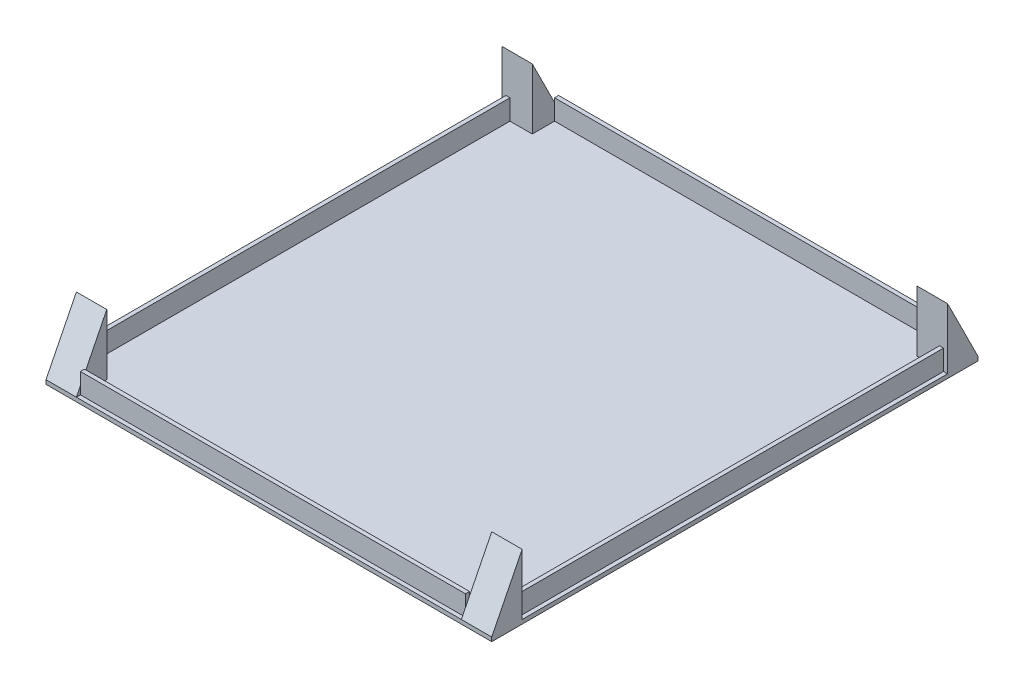
ISO-10303-21;
HEADER;
FILE_DESCRIPTION(('STEP AP214'),'2;1');
FILE_NAME('part.step','',(''),(''),'','','');
FILE_SCHEMA(('AUTOMOTIVE_DESIGN { 1 0 10303 214 1 1 1 1 }'));
ENDSEC;
DATA;
#1=APPLICATION_CONTEXT('core data for automotive mechanical design processes');
#2=APPLICATION_PROTOCOL_DEFINITION('international standard','automotive_design',2000,#1);
#3=PRODUCT_CONTEXT('',#1,'mechanical');
#4=PRODUCT('Part','Part','',(#3));
#5=PRODUCT_RELATED_PRODUCT_CATEGORY('part','',(#4));
#6=PRODUCT_DEFINITION_FORMATION('','',#4);
#7=PRODUCT_DEFINITION_CONTEXT('part definition',#1,'design');
#8=PRODUCT_DEFINITION('design','',#6,#7);
#9=PRODUCT_DEFINITION_SHAPE('','',#8);
#10=(LENGTH_UNIT() NAMED_UNIT(*) SI_UNIT(.MILLI.,.METRE.));
#11=(NAMED_UNIT(*) PLANE_ANGLE_UNIT() SI_UNIT($,.RADIAN.));
#12=(NAMED_UNIT(*) SI_UNIT($,.STERADIAN.) SOLID_ANGLE_UNIT());
#13=UNCERTAINTY_MEASURE_WITH_UNIT(LENGTH_MEASURE(1.E-05),#10,'distance_accuracy_value','');
#14=(GEOMETRIC_REPRESENTATION_CONTEXT(3) GLOBAL_UNCERTAINTY_ASSIGNED_CONTEXT((#13)) GLOBAL_UNIT_ASSIGNED_CONTEXT((#10,
#11,#12)) REPRESENTATION_CONTEXT('',''));
#15=CARTESIAN_POINT('',(0.,0.,0.));
#16=DIRECTION('',(0.,0.,1.));
#17=DIRECTION('',(1.,0.,0.));
#18=AXIS2_PLACEMENT_3D('',#15,#16,#17);
#19=CARTESIAN_POINT('',(0.,2.,0.));
#20=DIRECTION('',(0.,1.,0.));
#21=DIRECTION('',(0.,0.,1.));
#22=AXIS2_PLACEMENT_3D('',#19,#20,#21);
#23=PLANE('',#22);
#24=DIRECTION('',(-1.,0.,0.));
#25=VECTOR('',#24,1.);
#26=CARTESIAN_POINT('',(-95.,2.,105.));
#27=LINE('',#26,#25);
#28=CARTESIAN_POINT('',(-108.,2.,105.));
#29=VERTEX_POINT('',#28);
#30=CARTESIAN_POINT('',(-110.,2.,105.));
#31=VERTEX_POINT('',#30);
#32=EDGE_CURVE('E291',#29,#31,#27,.T.);
#33=ORIENTED_EDGE('',*,*,#32,.F.);
#34=DIRECTION('',(0.,0.,1.));
#35=VECTOR('',#34,1.);
#36=CARTESIAN_POINT('',(-108.,2.,105.));
#37=LINE('',#36,#35);
#38=CARTESIAN_POINT('',(-108.,2.,-105.));
#39=VERTEX_POINT('',#38);
#40=EDGE_CURVE('E481',#39,#29,#37,.T.);
#41=ORIENTED_EDGE('',*,*,#40,.F.);
#42=DIRECTION('',(-1.,0.,0.));
#43=VECTOR('',#42,1.);
#44=CARTESIAN_POINT('',(-95.,2.,-105.));
#45=LINE('',#44,#43);
#46=CARTESIAN_POINT('',(-110.,2.,-105.));
#47=VERTEX_POINT('',#46);
#48=EDGE_CURVE('E69',#39,#47,#45,.T.);
#49=ORIENTED_EDGE('',*,*,#48,.T.);
#50=DIRECTION('',(0.,0.,1.));
#51=VECTOR('',#50,1.);
#52=CARTESIAN_POINT('',(-110.,2.,-120.));
#53=LINE('',#52,#51);
#54=EDGE_CURVE('E573',#47,#31,#53,.T.);
#55=ORIENTED_EDGE('',*,*,#54,.T.);
#56=EDGE_LOOP('',(#33,#41,#49,#55));
#57=FACE_BOUND('',#56,.T.);
#58=ADVANCED_FACE('F45',(#57),#23,.T.);
#59=DIRECTION('',(0.,0.,1.));
#60=VECTOR('',#59,1.);
#61=CARTESIAN_POINT('',(-95.,2.,120.));
#62=LINE('',#61,#60);
#63=CARTESIAN_POINT('',(-95.,2.,118.000000000001));
#64=VERTEX_POINT('',#63);
#65=CARTESIAN_POINT('',(-95.,2.,120.));
#66=VERTEX_POINT('',#65);
#67=EDGE_CURVE('E298',#64,#66,#62,.T.);
#68=ORIENTED_EDGE('',*,*,#67,.T.);
#69=DIRECTION('',(1.,0.,0.));
#70=VECTOR('',#69,1.);
#71=CARTESIAN_POINT('',(-110.,2.,120.));
#72=LINE('',#71,#70);
#73=CARTESIAN_POINT('',(95.,2.,120.));
#74=VERTEX_POINT('',#73);
#75=EDGE_CURVE('E576',#66,#74,#72,.T.);
#76=ORIENTED_EDGE('',*,*,#75,.T.);
#77=DIRECTION('',(0.,0.,-1.));
#78=VECTOR('',#77,1.);
#79=CARTESIAN_POINT('',(95.,2.,120.));
#80=LINE('',#79,#78);
#81=CARTESIAN_POINT('',(95.,2.,117.999999999999));
#82=VERTEX_POINT('',#81);
#83=EDGE_CURVE('E357',#74,#82,#80,.T.);
#84=ORIENTED_EDGE('',*,*,#83,.T.);
#85=DIRECTION('',(1.,0.,0.));
#86=VECTOR('',#85,1.);
#87=CARTESIAN_POINT('',(95.,2.,117.999999999999));
#88=LINE('',#87,#86);
#89=EDGE_CURVE('E521',#64,#82,#88,.T.);
#90=ORIENTED_EDGE('',*,*,#89,.F.);
#91=EDGE_LOOP('',(#68,#76,#84,#90));
#92=FACE_BOUND('',#91,.T.);
#93=ADVANCED_FACE('F649',(#92),#23,.T.);
#94=DIRECTION('',(1.,0.,0.));
#95=VECTOR('',#94,1.);
#96=CARTESIAN_POINT('',(-110.,2.,-120.));
#97=LINE('',#96,#95);
#98=CARTESIAN_POINT('',(-95.,2.,-120.));
#99=VERTEX_POINT('',#98);
#100=CARTESIAN_POINT('',(95.,2.,-120.));
#101=VERTEX_POINT('',#100);
#102=EDGE_CURVE('E585',#99,#101,#97,.T.);
#103=ORIENTED_EDGE('',*,*,#102,.F.);
#104=DIRECTION('',(0.,0.,1.));
#105=VECTOR('',#104,1.);
#106=CARTESIAN_POINT('',(-95.,2.,-105.));
#107=LINE('',#106,#105);
#108=CARTESIAN_POINT('',(-95.,2.,-118.));
#109=VERTEX_POINT('',#108);
#110=EDGE_CURVE('E334',#99,#109,#107,.T.);
#111=ORIENTED_EDGE('',*,*,#110,.T.);
#112=DIRECTION('',(-1.,0.,0.));
#113=VECTOR('',#112,1.);
#114=CARTESIAN_POINT('',(-95.,2.,-118.));
#115=LINE('',#114,#113);
#116=CARTESIAN_POINT('',(94.9999999999999,2.,-118.));
#117=VERTEX_POINT('',#116);
#118=EDGE_CURVE('E430',#117,#109,#115,.T.);
#119=ORIENTED_EDGE('',*,*,#118,.F.);
#120=DIRECTION('',(0.,0.,-1.));
#121=VECTOR('',#120,1.);
#122=CARTESIAN_POINT('',(95.,2.,-120.));
#123=LINE('',#122,#121);
#124=EDGE_CURVE('E389',#117,#101,#123,.T.);
#125=ORIENTED_EDGE('',*,*,#124,.T.);
#126=EDGE_LOOP('',(#103,#111,#119,#125));
#127=FACE_BOUND('',#126,.T.);
#128=ADVANCED_FACE('F656',(#127),#23,.T.);
#129=CARTESIAN_POINT('',(-95.,2.,105.));
#130=VERTEX_POINT('',#129);
#131=CARTESIAN_POINT('',(-106.,2.,105.));
#132=VERTEX_POINT('',#131);
#133=EDGE_CURVE('E312',#130,#132,#27,.T.);
#134=ORIENTED_EDGE('',*,*,#133,.F.);
#135=CARTESIAN_POINT('',(-95.,2.,115.999999999998));
#136=VERTEX_POINT('',#135);
#137=EDGE_CURVE('E292',#130,#136,#62,.T.);
#138=ORIENTED_EDGE('',*,*,#137,.T.);
#139=DIRECTION('',(-1.,0.,0.));
#140=VECTOR('',#139,1.);
#141=CARTESIAN_POINT('',(95.,2.,115.999999999999));
#142=LINE('',#141,#140);
#143=CARTESIAN_POINT('',(95.,2.,115.999999999999));
#144=VERTEX_POINT('',#143);
#145=EDGE_CURVE('E470',#144,#136,#142,.T.);
#146=ORIENTED_EDGE('',*,*,#145,.F.);
#147=CARTESIAN_POINT('',(95.,2.,105.));
#148=VERTEX_POINT('',#147);
#149=EDGE_CURVE('E354',#144,#148,#80,.T.);
#150=ORIENTED_EDGE('',*,*,#149,.T.);
#151=DIRECTION('',(1.,0.,0.));
#152=VECTOR('',#151,1.);
#153=CARTESIAN_POINT('',(95.,2.,105.));
#154=LINE('',#153,#152);
#155=CARTESIAN_POINT('',(106.000000000001,2.,105.));
#156=VERTEX_POINT('',#155);
#157=EDGE_CURVE('E379',#148,#156,#154,.T.);
#158=ORIENTED_EDGE('',*,*,#157,.T.);
#159=DIRECTION('',(0.,0.,1.));
#160=VECTOR('',#159,1.);
#161=CARTESIAN_POINT('',(106.,2.,-105.));
#162=LINE('',#161,#160);
#163=CARTESIAN_POINT('',(106.,2.,-105.));
#164=VERTEX_POINT('',#163);
#165=EDGE_CURVE('E506',#164,#156,#162,.T.);
#166=ORIENTED_EDGE('',*,*,#165,.F.);
#167=DIRECTION('',(1.,0.,0.));
#168=VECTOR('',#167,1.);
#169=CARTESIAN_POINT('',(95.,2.,-105.));
#170=LINE('',#169,#168);
#171=CARTESIAN_POINT('',(95.,2.,-105.));
#172=VERTEX_POINT('',#171);
#173=EDGE_CURVE('E390',#172,#164,#170,.T.);
#174=ORIENTED_EDGE('',*,*,#173,.F.);
#175=CARTESIAN_POINT('',(95.,2.,-116.));
#176=VERTEX_POINT('',#175);
#177=EDGE_CURVE('E405',#172,#176,#123,.T.);
#178=ORIENTED_EDGE('',*,*,#177,.T.);
#179=DIRECTION('',(1.,0.,0.));
#180=VECTOR('',#179,1.);
#181=CARTESIAN_POINT('',(-95.,2.,-116.));
#182=LINE('',#181,#180);
#183=CARTESIAN_POINT('',(-95.,2.,-116.));
#184=VERTEX_POINT('',#183);
#185=EDGE_CURVE('E440',#184,#176,#182,.T.);
#186=ORIENTED_EDGE('',*,*,#185,.F.);
#187=CARTESIAN_POINT('',(-95.,2.,-105.));
#188=VERTEX_POINT('',#187);
#189=EDGE_CURVE('E61',#184,#188,#107,.T.);
#190=ORIENTED_EDGE('',*,*,#189,.T.);
#191=CARTESIAN_POINT('',(-106.,2.,-105.));
#192=VERTEX_POINT('',#191);
#193=EDGE_CURVE('E316',#188,#192,#45,.T.);
#194=ORIENTED_EDGE('',*,*,#193,.T.);
#195=DIRECTION('',(0.,0.,-1.));
#196=VECTOR('',#195,1.);
#197=CARTESIAN_POINT('',(-106.,2.,105.));
#198=LINE('',#197,#196);
#199=EDGE_CURVE('E444',#132,#192,#198,.T.);
#200=ORIENTED_EDGE('',*,*,#199,.F.);
#201=EDGE_LOOP('',(#134,#138,#146,#150,#158,#166,#174,#178,#186,#190,#194,#200));
#202=FACE_BOUND('',#201,.T.);
#203=ADVANCED_FACE('F661',(#202),#23,.T.);
#204=CARTESIAN_POINT('',(107.999999999993,2.,105.));
#205=VERTEX_POINT('',#204);
#206=CARTESIAN_POINT('',(110.,2.,105.));
#207=VERTEX_POINT('',#206);
#208=EDGE_CURVE('E382',#205,#207,#154,.T.);
#209=ORIENTED_EDGE('',*,*,#208,.T.);
#210=DIRECTION('',(0.,0.,1.));
#211=VECTOR('',#210,1.);
#212=CARTESIAN_POINT('',(110.,2.,-120.));
#213=LINE('',#212,#211);
#214=CARTESIAN_POINT('',(110.,2.,-105.));
#215=VERTEX_POINT('',#214);
#216=EDGE_CURVE('E581',#215,#207,#213,.T.);
#217=ORIENTED_EDGE('',*,*,#216,.F.);
#218=CARTESIAN_POINT('',(107.999999999993,2.,-105.));
#219=VERTEX_POINT('',#218);
#220=EDGE_CURVE('E393',#219,#215,#170,.T.);
#221=ORIENTED_EDGE('',*,*,#220,.F.);
#222=DIRECTION('',(0.,0.,-1.));
#223=VECTOR('',#222,1.);
#224=CARTESIAN_POINT('',(107.999999999993,2.,-105.));
#225=LINE('',#224,#223);
#226=EDGE_CURVE('E553',#205,#219,#225,.T.);
#227=ORIENTED_EDGE('',*,*,#226,.F.);
#228=EDGE_LOOP('',(#209,#217,#221,#227));
#229=FACE_BOUND('',#228,.T.);
#230=ADVANCED_FACE('F651',(#229),#23,.T.);
#231=CARTESIAN_POINT('',(-110.,2.,-120.));
#232=DIRECTION('',(1.,0.,0.));
#233=DIRECTION('',(0.,0.,-1.));
#234=AXIS2_PLACEMENT_3D('',#231,#232,#233);
#235=PLANE('',#234);
#236=DIRECTION('',(0.,0.,1.));
#237=VECTOR('',#236,1.);
#238=CARTESIAN_POINT('',(-110.,0.,-120.));
#239=LINE('',#238,#237);
#240=CARTESIAN_POINT('',(-110.,0.,-120.));
#241=VERTEX_POINT('',#240);
#242=CARTESIAN_POINT('',(-110.,0.,120.));
#243=VERTEX_POINT('',#242);
#244=EDGE_CURVE('E464',#241,#243,#239,.T.);
#245=ORIENTED_EDGE('',*,*,#244,.T.);
#246=DIRECTION('',(0.,-1.,0.));
#247=VECTOR('',#246,1.);
#248=CARTESIAN_POINT('',(-110.,2.,120.));
#249=LINE('',#248,#247);
#250=CARTESIAN_POINT('',(-110.,2.,120.));
#251=VERTEX_POINT('',#250);
#252=EDGE_CURVE('E11',#251,#243,#249,.T.);
#253=ORIENTED_EDGE('',*,*,#252,.F.);
#254=DIRECTION('',(0.,0.894427190999916,-0.447213595499958));
#255=VECTOR('',#254,1.);
#256=CARTESIAN_POINT('',(-110.,32.,105.));
#257=LINE('',#256,#255);
#258=CARTESIAN_POINT('',(-110.,32.,105.));
#259=VERTEX_POINT('',#258);
#260=EDGE_CURVE('E306',#251,#259,#257,.T.);
#261=ORIENTED_EDGE('',*,*,#260,.T.);
#262=DIRECTION('',(0.,-1.,0.));
#263=VECTOR('',#262,1.);
#264=CARTESIAN_POINT('',(-110.,2.,105.));
#265=LINE('',#264,#263);
#266=EDGE_CURVE('E281',#259,#31,#265,.T.);
#267=ORIENTED_EDGE('',*,*,#266,.T.);
#268=ORIENTED_EDGE('',*,*,#54,.F.);
#269=DIRECTION('',(0.,1.,0.));
#270=VECTOR('',#269,1.);
#271=CARTESIAN_POINT('',(-110.,32.,-105.));
#272=LINE('',#271,#270);
#273=CARTESIAN_POINT('',(-110.,32.,-105.));
#274=VERTEX_POINT('',#273);
#275=EDGE_CURVE('E323',#47,#274,#272,.T.);
#276=ORIENTED_EDGE('',*,*,#275,.T.);
#277=DIRECTION('',(0.,-0.894427190999916,-0.447213595499959));
#278=VECTOR('',#277,1.);
#279=CARTESIAN_POINT('',(-110.,2.,-120.));
#280=LINE('',#279,#278);
#281=CARTESIAN_POINT('',(-110.,2.,-120.));
#282=VERTEX_POINT('',#281);
#283=EDGE_CURVE('E309',#274,#282,#280,.T.);
#284=ORIENTED_EDGE('',*,*,#283,.T.);
#285=DIRECTION('',(0.,-1.,0.));
#286=VECTOR('',#285,1.);
#287=CARTESIAN_POINT('',(-110.,2.,-120.));
#288=LINE('',#287,#286);
#289=EDGE_CURVE('E590',#282,#241,#288,.T.);
#290=ORIENTED_EDGE('',*,*,#289,.T.);
#291=EDGE_LOOP('',(#245,#253,#261,#267,#268,#276,#284,#290));
#292=FACE_BOUND('',#291,.T.);
#293=ADVANCED_FACE('F47',(#292),#235,.F.);
#294=CARTESIAN_POINT('',(-110.,2.,120.));
#295=DIRECTION('',(0.,0.,-1.));
#296=DIRECTION('',(-1.,0.,0.));
#297=AXIS2_PLACEMENT_3D('',#294,#295,#296);
#298=PLANE('',#297);
#299=DIRECTION('',(1.,0.,0.));
#300=VECTOR('',#299,1.);
#301=CARTESIAN_POINT('',(-110.,0.,120.));
#302=LINE('',#301,#300);
#303=CARTESIAN_POINT('',(110.,0.,120.));
#304=VERTEX_POINT('',#303);
#305=EDGE_CURVE('E594',#243,#304,#302,.T.);
#306=ORIENTED_EDGE('',*,*,#305,.T.);
#307=DIRECTION('',(0.,-1.,0.));
#308=VECTOR('',#307,1.);
#309=CARTESIAN_POINT('',(110.,2.,120.));
#310=LINE('',#309,#308);
#311=CARTESIAN_POINT('',(110.,2.,120.));
#312=VERTEX_POINT('',#311);
#313=EDGE_CURVE('E54',#312,#304,#310,.T.);
#314=ORIENTED_EDGE('',*,*,#313,.F.);
#315=DIRECTION('',(1.,0.,0.));
#316=VECTOR('',#315,1.);
#317=CARTESIAN_POINT('',(95.,2.,120.));
#318=LINE('',#317,#316);
#319=EDGE_CURVE('E365',#74,#312,#318,.T.);
#320=ORIENTED_EDGE('',*,*,#319,.F.);
#321=ORIENTED_EDGE('',*,*,#75,.F.);
#322=EDGE_CURVE('E578',#251,#66,#72,.T.);
#323=ORIENTED_EDGE('',*,*,#322,.F.);
#324=ORIENTED_EDGE('',*,*,#252,.T.);
#325=EDGE_LOOP('',(#306,#314,#320,#321,#323,#324));
#326=FACE_BOUND('',#325,.T.);
#327=ADVANCED_FACE('F617',(#326),#298,.F.);
#328=CARTESIAN_POINT('',(110.,2.,-120.));
#329=DIRECTION('',(1.,0.,0.));
#330=DIRECTION('',(0.,0.,-1.));
#331=AXIS2_PLACEMENT_3D('',#328,#329,#330);
#332=PLANE('',#331);
#333=DIRECTION('',(0.,0.,1.));
#334=VECTOR('',#333,1.);
#335=CARTESIAN_POINT('',(110.,0.,-120.));
#336=LINE('',#335,#334);
#337=CARTESIAN_POINT('',(110.,0.,-120.));
#338=VERTEX_POINT('',#337);
#339=EDGE_CURVE('E598',#338,#304,#336,.T.);
#340=ORIENTED_EDGE('',*,*,#339,.F.);
#341=DIRECTION('',(0.,-1.,0.));
#342=VECTOR('',#341,1.);
#343=CARTESIAN_POINT('',(110.,2.,-120.));
#344=LINE('',#343,#342);
#345=CARTESIAN_POINT('',(110.,2.,-120.));
#346=VERTEX_POINT('',#345);
#347=EDGE_CURVE('E607',#346,#338,#344,.T.);
#348=ORIENTED_EDGE('',*,*,#347,.F.);
#349=DIRECTION('',(0.,0.894427190999916,0.447213595499958));
#350=VECTOR('',#349,1.);
#351=CARTESIAN_POINT('',(110.,32.,-105.));
#352=LINE('',#351,#350);
#353=CARTESIAN_POINT('',(110.,32.,-105.));
#354=VERTEX_POINT('',#353);
#355=EDGE_CURVE('E371',#346,#354,#352,.T.);
#356=ORIENTED_EDGE('',*,*,#355,.T.);
#357=DIRECTION('',(0.,-1.,0.));
#358=VECTOR('',#357,1.);
#359=CARTESIAN_POINT('',(110.,2.,-105.));
#360=LINE('',#359,#358);
#361=EDGE_CURVE('E397',#354,#215,#360,.T.);
#362=ORIENTED_EDGE('',*,*,#361,.T.);
#363=ORIENTED_EDGE('',*,*,#216,.T.);
#364=DIRECTION('',(0.,1.,0.));
#365=VECTOR('',#364,1.);
#366=CARTESIAN_POINT('',(110.,2.,105.));
#367=LINE('',#366,#365);
#368=CARTESIAN_POINT('',(110.,32.,105.));
#369=VERTEX_POINT('',#368);
#370=EDGE_CURVE('E370',#207,#369,#367,.T.);
#371=ORIENTED_EDGE('',*,*,#370,.T.);
#372=DIRECTION('',(0.,-0.894427190999916,0.447213595499958));
#373=VECTOR('',#372,1.);
#374=CARTESIAN_POINT('',(110.,32.,105.));
#375=LINE('',#374,#373);
#376=EDGE_CURVE('E366',#369,#312,#375,.T.);
#377=ORIENTED_EDGE('',*,*,#376,.T.);
#378=ORIENTED_EDGE('',*,*,#313,.T.);
#379=EDGE_LOOP('',(#340,#348,#356,#362,#363,#371,#377,#378));
#380=FACE_BOUND('',#379,.T.);
#381=ADVANCED_FACE('F612',(#380),#332,.T.);
#382=CARTESIAN_POINT('',(-110.,2.,-120.));
#383=DIRECTION('',(0.,0.,-1.));
#384=DIRECTION('',(-1.,0.,0.));
#385=AXIS2_PLACEMENT_3D('',#382,#383,#384);
#386=PLANE('',#385);
#387=DIRECTION('',(1.,0.,0.));
#388=VECTOR('',#387,1.);
#389=CARTESIAN_POINT('',(-110.,0.,-120.));
#390=LINE('',#389,#388);
#391=EDGE_CURVE('E577',#241,#338,#390,.T.);
#392=ORIENTED_EDGE('',*,*,#391,.F.);
#393=ORIENTED_EDGE('',*,*,#289,.F.);
#394=EDGE_CURVE('E586',#282,#99,#97,.T.);
#395=ORIENTED_EDGE('',*,*,#394,.T.);
#396=ORIENTED_EDGE('',*,*,#102,.T.);
#397=DIRECTION('',(1.,0.,0.));
#398=VECTOR('',#397,1.);
#399=CARTESIAN_POINT('',(95.,2.,-120.));
#400=LINE('',#399,#398);
#401=EDGE_CURVE('E349',#101,#346,#400,.T.);
#402=ORIENTED_EDGE('',*,*,#401,.T.);
#403=ORIENTED_EDGE('',*,*,#347,.T.);
#404=EDGE_LOOP('',(#392,#393,#395,#396,#402,#403));
#405=FACE_BOUND('',#404,.T.);
#406=ADVANCED_FACE('F625',(#405),#386,.T.);
#407=CARTESIAN_POINT('',(0.,0.,0.));
#408=DIRECTION('',(0.,1.,0.));
#409=DIRECTION('',(0.,0.,1.));
#410=AXIS2_PLACEMENT_3D('',#407,#408,#409);
#411=PLANE('',#410);
#412=ORIENTED_EDGE('',*,*,#244,.F.);
#413=ORIENTED_EDGE('',*,*,#391,.T.);
#414=ORIENTED_EDGE('',*,*,#339,.T.);
#415=ORIENTED_EDGE('',*,*,#305,.F.);
#416=EDGE_LOOP('',(#412,#413,#414,#415));
#417=FACE_BOUND('',#416,.T.);
#418=ADVANCED_FACE('F622',(#417),#411,.F.);
#419=CARTESIAN_POINT('',(106.,12.,-105.));
#420=DIRECTION('',(1.,0.,0.));
#421=DIRECTION('',(0.,0.,-1.));
#422=AXIS2_PLACEMENT_3D('',#419,#420,#421);
#423=PLANE('',#422);
#424=ORIENTED_EDGE('',*,*,#165,.T.);
#425=DIRECTION('',(0.,-1.,0.));
#426=VECTOR('',#425,1.);
#427=CARTESIAN_POINT('',(106.000000000001,12.,105.));
#428=LINE('',#427,#426);
#429=CARTESIAN_POINT('',(106.000000000001,12.,105.));
#430=VERTEX_POINT('',#429);
#431=EDGE_CURVE('E542',#430,#156,#428,.T.);
#432=ORIENTED_EDGE('',*,*,#431,.F.);
#433=DIRECTION('',(0.,0.,1.));
#434=VECTOR('',#433,1.);
#435=CARTESIAN_POINT('',(106.,12.,-105.));
#436=LINE('',#435,#434);
#437=CARTESIAN_POINT('',(106.,12.,-105.));
#438=VERTEX_POINT('',#437);
#439=EDGE_CURVE('E567',#438,#430,#436,.T.);
#440=ORIENTED_EDGE('',*,*,#439,.F.);
#441=DIRECTION('',(0.,-1.,0.));
#442=VECTOR('',#441,1.);
#443=CARTESIAN_POINT('',(106.,12.,-105.));
#444=LINE('',#443,#442);
#445=EDGE_CURVE('E424',#438,#164,#444,.T.);
#446=ORIENTED_EDGE('',*,*,#445,.T.);
#447=EDGE_LOOP('',(#424,#432,#440,#446));
#448=FACE_BOUND('',#447,.T.);
#449=ADVANCED_FACE('F723',(#448),#423,.F.);
#450=CARTESIAN_POINT('',(107.999999999993,12.,-105.));
#451=DIRECTION('',(-1.,0.,0.));
#452=DIRECTION('',(0.,0.,1.));
#453=AXIS2_PLACEMENT_3D('',#450,#451,#452);
#454=PLANE('',#453);
#455=ORIENTED_EDGE('',*,*,#226,.T.);
#456=DIRECTION('',(0.,-1.,0.));
#457=VECTOR('',#456,1.);
#458=CARTESIAN_POINT('',(107.999999999993,12.,-105.));
#459=LINE('',#458,#457);
#460=CARTESIAN_POINT('',(107.999999999993,12.,-105.));
#461=VERTEX_POINT('',#460);
#462=EDGE_CURVE('E549',#461,#219,#459,.T.);
#463=ORIENTED_EDGE('',*,*,#462,.F.);
#464=DIRECTION('',(0.,0.,-1.));
#465=VECTOR('',#464,1.);
#466=CARTESIAN_POINT('',(107.999999999993,12.,-105.));
#467=LINE('',#466,#465);
#468=CARTESIAN_POINT('',(107.999999999993,12.,105.));
#469=VERTEX_POINT('',#468);
#470=EDGE_CURVE('E552',#469,#461,#467,.T.);
#471=ORIENTED_EDGE('',*,*,#470,.F.);
#472=DIRECTION('',(0.,-1.,0.));
#473=VECTOR('',#472,1.);
#474=CARTESIAN_POINT('',(107.999999999993,12.,105.));
#475=LINE('',#474,#473);
#476=EDGE_CURVE('E546',#469,#205,#475,.T.);
#477=ORIENTED_EDGE('',*,*,#476,.T.);
#478=EDGE_LOOP('',(#455,#463,#471,#477));
#479=FACE_BOUND('',#478,.T.);
#480=ADVANCED_FACE('F730',(#479),#454,.F.);
#481=CARTESIAN_POINT('',(0.,12.,0.));
#482=DIRECTION('',(0.,1.,0.));
#483=DIRECTION('',(0.,0.,1.));
#484=AXIS2_PLACEMENT_3D('',#481,#482,#483);
#485=PLANE('',#484);
#486=DIRECTION('',(-1.,0.,0.));
#487=VECTOR('',#486,1.);
#488=CARTESIAN_POINT('',(107.999999999993,12.,-105.));
#489=LINE('',#488,#487);
#490=EDGE_CURVE('E557',#461,#438,#489,.T.);
#491=ORIENTED_EDGE('',*,*,#490,.T.);
#492=ORIENTED_EDGE('',*,*,#439,.T.);
#493=DIRECTION('',(1.,0.,0.));
#494=VECTOR('',#493,1.);
#495=CARTESIAN_POINT('',(107.999999999993,12.,105.));
#496=LINE('',#495,#494);
#497=EDGE_CURVE('E564',#430,#469,#496,.T.);
#498=ORIENTED_EDGE('',*,*,#497,.T.);
#499=ORIENTED_EDGE('',*,*,#470,.T.);
#500=EDGE_LOOP('',(#491,#492,#498,#499));
#501=FACE_BOUND('',#500,.T.);
#502=ADVANCED_FACE('F727',(#501),#485,.T.);
#503=CARTESIAN_POINT('',(95.,12.,117.999999999999));
#504=DIRECTION('',(-1.,0.,0.));
#505=DIRECTION('',(0.,0.,1.));
#506=AXIS2_PLACEMENT_3D('',#503,#504,#505);
#507=PLANE('',#506);
#508=DIRECTION('',(0.,-1.,0.));
#509=VECTOR('',#508,1.);
#510=CARTESIAN_POINT('',(95.,12.,117.999999999999));
#511=LINE('',#510,#509);
#512=CARTESIAN_POINT('',(95.,12.,117.999999999999));
#513=VERTEX_POINT('',#512);
#514=CARTESIAN_POINT('',(95.,6.00000000000117,117.999999999999));
#515=VERTEX_POINT('',#514);
#516=EDGE_CURVE('E516',#513,#515,#511,.T.);
#517=ORIENTED_EDGE('',*,*,#516,.T.);
#518=DIRECTION('',(0.,-0.894427190999916,0.447213595499958));
#519=VECTOR('',#518,1.);
#520=CARTESIAN_POINT('',(95.,32.,105.));
#521=LINE('',#520,#519);
#522=CARTESIAN_POINT('',(95.,10.0000000000012,115.999999999999));
#523=VERTEX_POINT('',#522);
#524=EDGE_CURVE('E355',#523,#515,#521,.T.);
#525=ORIENTED_EDGE('',*,*,#524,.F.);
#526=DIRECTION('',(0.,-1.,0.));
#527=VECTOR('',#526,1.);
#528=CARTESIAN_POINT('',(95.,12.,115.999999999999));
#529=LINE('',#528,#527);
#530=CARTESIAN_POINT('',(95.,12.,115.999999999999));
#531=VERTEX_POINT('',#530);
#532=EDGE_CURVE('E501',#531,#523,#529,.T.);
#533=ORIENTED_EDGE('',*,*,#532,.F.);
#534=DIRECTION('',(0.,0.,-1.));
#535=VECTOR('',#534,1.);
#536=CARTESIAN_POINT('',(95.,12.,117.999999999999));
#537=LINE('',#536,#535);
#538=EDGE_CURVE('E524',#513,#531,#537,.T.);
#539=ORIENTED_EDGE('',*,*,#538,.F.);
#540=EDGE_LOOP('',(#517,#525,#533,#539));
#541=FACE_BOUND('',#540,.T.);
#542=ADVANCED_FACE('F736',(#541),#507,.F.);
#543=CARTESIAN_POINT('',(95.,12.,115.999999999999));
#544=DIRECTION('',(0.,0.,1.));
#545=DIRECTION('',(1.,0.,0.));
#546=AXIS2_PLACEMENT_3D('',#543,#544,#545);
#547=PLANE('',#546);
#548=ORIENTED_EDGE('',*,*,#145,.T.);
#549=DIRECTION('',(0.,1.,0.));
#550=VECTOR('',#549,1.);
#551=CARTESIAN_POINT('',(-95.,12.,115.999999999998));
#552=LINE('',#551,#550);
#553=CARTESIAN_POINT('',(-95.,10.0000000000038,115.999999999998));
#554=VERTEX_POINT('',#553);
#555=EDGE_CURVE('E346',#136,#554,#552,.T.);
#556=ORIENTED_EDGE('',*,*,#555,.T.);
#557=DIRECTION('',(0.,-1.,0.));
#558=VECTOR('',#557,1.);
#559=CARTESIAN_POINT('',(-95.,12.,115.999999999998));
#560=LINE('',#559,#558);
#561=CARTESIAN_POINT('',(-95.,12.,115.999999999998));
#562=VERTEX_POINT('',#561);
#563=EDGE_CURVE('E505',#562,#554,#560,.T.);
#564=ORIENTED_EDGE('',*,*,#563,.F.);
#565=DIRECTION('',(-1.,0.,0.));
#566=VECTOR('',#565,1.);
#567=CARTESIAN_POINT('',(95.,12.,115.999999999999));
#568=LINE('',#567,#566);
#569=EDGE_CURVE('E533',#531,#562,#568,.T.);
#570=ORIENTED_EDGE('',*,*,#569,.F.);
#571=ORIENTED_EDGE('',*,*,#532,.T.);
#572=DIRECTION('',(0.,1.,0.));
#573=VECTOR('',#572,1.);
#574=CARTESIAN_POINT('',(95.,12.,115.999999999999));
#575=LINE('',#574,#573);
#576=EDGE_CURVE('E420',#144,#523,#575,.T.);
#577=ORIENTED_EDGE('',*,*,#576,.F.);
#578=EDGE_LOOP('',(#548,#556,#564,#570,#571,#577));
#579=FACE_BOUND('',#578,.T.);
#580=ADVANCED_FACE('F740',(#579),#547,.F.);
#581=CARTESIAN_POINT('',(-95.,12.,115.999999999998));
#582=DIRECTION('',(1.,0.,0.));
#583=DIRECTION('',(0.,0.,-1.));
#584=AXIS2_PLACEMENT_3D('',#581,#582,#583);
#585=PLANE('',#584);
#586=ORIENTED_EDGE('',*,*,#563,.T.);
#587=DIRECTION('',(0.,0.894427190999916,-0.447213595499958));
#588=VECTOR('',#587,1.);
#589=CARTESIAN_POINT('',(-95.,32.,105.));
#590=LINE('',#589,#588);
#591=CARTESIAN_POINT('',(-95.,5.99999999999851,118.000000000001));
#592=VERTEX_POINT('',#591);
#593=EDGE_CURVE('E276',#592,#554,#590,.T.);
#594=ORIENTED_EDGE('',*,*,#593,.F.);
#595=DIRECTION('',(0.,-1.,0.));
#596=VECTOR('',#595,1.);
#597=CARTESIAN_POINT('',(-95.,12.,118.000000000001));
#598=LINE('',#597,#596);
#599=CARTESIAN_POINT('',(-95.,12.,118.000000000001));
#600=VERTEX_POINT('',#599);
#601=EDGE_CURVE('E511',#600,#592,#598,.T.);
#602=ORIENTED_EDGE('',*,*,#601,.F.);
#603=DIRECTION('',(0.,0.,1.));
#604=VECTOR('',#603,1.);
#605=CARTESIAN_POINT('',(-95.,12.,115.999999999998));
#606=LINE('',#605,#604);
#607=EDGE_CURVE('E530',#562,#600,#606,.T.);
#608=ORIENTED_EDGE('',*,*,#607,.F.);
#609=EDGE_LOOP('',(#586,#594,#602,#608));
#610=FACE_BOUND('',#609,.T.);
#611=ADVANCED_FACE('F757',(#610),#585,.F.);
#612=CARTESIAN_POINT('',(95.,12.,117.999999999999));
#613=DIRECTION('',(0.,0.,-1.));
#614=DIRECTION('',(-1.,0.,0.));
#615=AXIS2_PLACEMENT_3D('',#612,#613,#614);
#616=PLANE('',#615);
#617=ORIENTED_EDGE('',*,*,#89,.T.);
#618=EDGE_CURVE('E515',#515,#82,#511,.T.);
#619=ORIENTED_EDGE('',*,*,#618,.F.);
#620=ORIENTED_EDGE('',*,*,#516,.F.);
#621=DIRECTION('',(1.,0.,0.));
#622=VECTOR('',#621,1.);
#623=CARTESIAN_POINT('',(95.,12.,117.999999999999));
#624=LINE('',#623,#622);
#625=EDGE_CURVE('E520',#600,#513,#624,.T.);
#626=ORIENTED_EDGE('',*,*,#625,.F.);
#627=ORIENTED_EDGE('',*,*,#601,.T.);
#628=EDGE_CURVE('E510',#592,#64,#598,.T.);
#629=ORIENTED_EDGE('',*,*,#628,.T.);
#630=EDGE_LOOP('',(#617,#619,#620,#626,#627,#629));
#631=FACE_BOUND('',#630,.T.);
#632=ADVANCED_FACE('F749',(#631),#616,.F.);
#633=CARTESIAN_POINT('',(0.,12.,0.));
#634=DIRECTION('',(0.,1.,0.));
#635=DIRECTION('',(0.,0.,1.));
#636=AXIS2_PLACEMENT_3D('',#633,#634,#635);
#637=PLANE('',#636);
#638=ORIENTED_EDGE('',*,*,#538,.T.);
#639=ORIENTED_EDGE('',*,*,#569,.T.);
#640=ORIENTED_EDGE('',*,*,#607,.T.);
#641=ORIENTED_EDGE('',*,*,#625,.T.);
#642=EDGE_LOOP('',(#638,#639,#640,#641));
#643=FACE_BOUND('',#642,.T.);
#644=ADVANCED_FACE('F745',(#643),#637,.T.);
#645=CARTESIAN_POINT('',(-106.,12.,105.));
#646=DIRECTION('',(-1.,0.,0.));
#647=DIRECTION('',(0.,0.,1.));
#648=AXIS2_PLACEMENT_3D('',#645,#646,#647);
#649=PLANE('',#648);
#650=ORIENTED_EDGE('',*,*,#199,.T.);
#651=DIRECTION('',(0.,-1.,0.));
#652=VECTOR('',#651,1.);
#653=CARTESIAN_POINT('',(-106.,12.,-105.));
#654=LINE('',#653,#652);
#655=CARTESIAN_POINT('',(-106.,12.,-105.));
#656=VERTEX_POINT('',#655);
#657=EDGE_CURVE('E469',#656,#192,#654,.T.);
#658=ORIENTED_EDGE('',*,*,#657,.F.);
#659=DIRECTION('',(0.,0.,-1.));
#660=VECTOR('',#659,1.);
#661=CARTESIAN_POINT('',(-106.,12.,105.));
#662=LINE('',#661,#660);
#663=CARTESIAN_POINT('',(-106.,12.,105.));
#664=VERTEX_POINT('',#663);
#665=EDGE_CURVE('E495',#664,#656,#662,.T.);
#666=ORIENTED_EDGE('',*,*,#665,.F.);
#667=DIRECTION('',(0.,-1.,0.));
#668=VECTOR('',#667,1.);
#669=CARTESIAN_POINT('',(-106.,12.,105.));
#670=LINE('',#669,#668);
#671=EDGE_CURVE('E465',#664,#132,#670,.T.);
#672=ORIENTED_EDGE('',*,*,#671,.T.);
#673=EDGE_LOOP('',(#650,#658,#666,#672));
#674=FACE_BOUND('',#673,.T.);
#675=ADVANCED_FACE('F788',(#674),#649,.F.);
#676=CARTESIAN_POINT('',(-108.,12.,105.));
#677=DIRECTION('',(1.,0.,0.));
#678=DIRECTION('',(0.,0.,-1.));
#679=AXIS2_PLACEMENT_3D('',#676,#677,#678);
#680=PLANE('',#679);
#681=ORIENTED_EDGE('',*,*,#40,.T.);
#682=DIRECTION('',(0.,-1.,0.));
#683=VECTOR('',#682,1.);
#684=CARTESIAN_POINT('',(-108.,12.,105.));
#685=LINE('',#684,#683);
#686=CARTESIAN_POINT('',(-108.,12.,105.));
#687=VERTEX_POINT('',#686);
#688=EDGE_CURVE('E477',#687,#29,#685,.T.);
#689=ORIENTED_EDGE('',*,*,#688,.F.);
#690=DIRECTION('',(0.,0.,1.));
#691=VECTOR('',#690,1.);
#692=CARTESIAN_POINT('',(-108.,12.,105.));
#693=LINE('',#692,#691);
#694=CARTESIAN_POINT('',(-108.,12.,-105.));
#695=VERTEX_POINT('',#694);
#696=EDGE_CURVE('E480',#695,#687,#693,.T.);
#697=ORIENTED_EDGE('',*,*,#696,.F.);
#698=DIRECTION('',(0.,-1.,0.));
#699=VECTOR('',#698,1.);
#700=CARTESIAN_POINT('',(-108.,12.,-105.));
#701=LINE('',#700,#699);
#702=EDGE_CURVE('E474',#695,#39,#701,.T.);
#703=ORIENTED_EDGE('',*,*,#702,.T.);
#704=EDGE_LOOP('',(#681,#689,#697,#703));
#705=FACE_BOUND('',#704,.T.);
#706=ADVANCED_FACE('F795',(#705),#680,.F.);
#707=CARTESIAN_POINT('',(0.,12.,0.));
#708=DIRECTION('',(0.,1.,0.));
#709=DIRECTION('',(0.,0.,1.));
#710=AXIS2_PLACEMENT_3D('',#707,#708,#709);
#711=PLANE('',#710);
#712=DIRECTION('',(1.,0.,0.));
#713=VECTOR('',#712,1.);
#714=CARTESIAN_POINT('',(-108.,12.,105.));
#715=LINE('',#714,#713);
#716=EDGE_CURVE('E485',#687,#664,#715,.T.);
#717=ORIENTED_EDGE('',*,*,#716,.T.);
#718=ORIENTED_EDGE('',*,*,#665,.T.);
#719=DIRECTION('',(-1.,0.,0.));
#720=VECTOR('',#719,1.);
#721=CARTESIAN_POINT('',(-108.,12.,-105.));
#722=LINE('',#721,#720);
#723=EDGE_CURVE('E492',#656,#695,#722,.T.);
#724=ORIENTED_EDGE('',*,*,#723,.T.);
#725=ORIENTED_EDGE('',*,*,#696,.T.);
#726=EDGE_LOOP('',(#717,#718,#724,#725));
#727=FACE_BOUND('',#726,.T.);
#728=ADVANCED_FACE('F792',(#727),#711,.T.);
#729=CARTESIAN_POINT('',(-95.,12.,-118.));
#730=DIRECTION('',(1.,0.,0.));
#731=DIRECTION('',(0.,0.,-1.));
#732=AXIS2_PLACEMENT_3D('',#729,#730,#731);
#733=PLANE('',#732);
#734=DIRECTION('',(0.,-1.,0.));
#735=VECTOR('',#734,1.);
#736=CARTESIAN_POINT('',(-95.,12.,-118.));
#737=LINE('',#736,#735);
#738=CARTESIAN_POINT('',(-95.,12.,-118.));
#739=VERTEX_POINT('',#738);
#740=CARTESIAN_POINT('',(-95.,6.,-118.));
#741=VERTEX_POINT('',#740);
#742=EDGE_CURVE('E447',#739,#741,#737,.T.);
#743=ORIENTED_EDGE('',*,*,#742,.T.);
#744=DIRECTION('',(0.,-0.894427190999916,-0.447213595499959));
#745=VECTOR('',#744,1.);
#746=CARTESIAN_POINT('',(-95.,2.,-120.));
#747=LINE('',#746,#745);
#748=CARTESIAN_POINT('',(-95.,9.99999999999999,-116.));
#749=VERTEX_POINT('',#748);
#750=EDGE_CURVE('E342',#749,#741,#747,.T.);
#751=ORIENTED_EDGE('',*,*,#750,.F.);
#752=DIRECTION('',(0.,-1.,0.));
#753=VECTOR('',#752,1.);
#754=CARTESIAN_POINT('',(-95.,12.,-116.));
#755=LINE('',#754,#753);
#756=CARTESIAN_POINT('',(-95.,12.,-116.));
#757=VERTEX_POINT('',#756);
#758=EDGE_CURVE('E460',#757,#749,#755,.T.);
#759=ORIENTED_EDGE('',*,*,#758,.F.);
#760=DIRECTION('',(0.,0.,1.));
#761=VECTOR('',#760,1.);
#762=CARTESIAN_POINT('',(-95.,12.,-118.));
#763=LINE('',#762,#761);
#764=EDGE_CURVE('E425',#739,#757,#763,.T.);
#765=ORIENTED_EDGE('',*,*,#764,.F.);
#766=EDGE_LOOP('',(#743,#751,#759,#765));
#767=FACE_BOUND('',#766,.T.);
#768=ADVANCED_FACE('F774',(#767),#733,.F.);
#769=CARTESIAN_POINT('',(-95.,12.,-116.));
#770=DIRECTION('',(0.,0.,-1.));
#771=DIRECTION('',(-1.,0.,0.));
#772=AXIS2_PLACEMENT_3D('',#769,#770,#771);
#773=PLANE('',#772);
#774=ORIENTED_EDGE('',*,*,#185,.T.);
#775=DIRECTION('',(0.,1.,0.));
#776=VECTOR('',#775,1.);
#777=CARTESIAN_POINT('',(95.,12.,-116.));
#778=LINE('',#777,#776);
#779=CARTESIAN_POINT('',(95.,10.,-116.));
#780=VERTEX_POINT('',#779);
#781=EDGE_CURVE('E378',#176,#780,#778,.T.);
#782=ORIENTED_EDGE('',*,*,#781,.T.);
#783=DIRECTION('',(0.,-1.,0.));
#784=VECTOR('',#783,1.);
#785=CARTESIAN_POINT('',(95.,12.,-116.));
#786=LINE('',#785,#784);
#787=CARTESIAN_POINT('',(95.,12.,-116.));
#788=VERTEX_POINT('',#787);
#789=EDGE_CURVE('E456',#788,#780,#786,.T.);
#790=ORIENTED_EDGE('',*,*,#789,.F.);
#791=DIRECTION('',(1.,0.,0.));
#792=VECTOR('',#791,1.);
#793=CARTESIAN_POINT('',(-95.,12.,-116.));
#794=LINE('',#793,#792);
#795=EDGE_CURVE('E429',#757,#788,#794,.T.);
#796=ORIENTED_EDGE('',*,*,#795,.F.);
#797=ORIENTED_EDGE('',*,*,#758,.T.);
#798=DIRECTION('',(0.,1.,0.));
#799=VECTOR('',#798,1.);
#800=CARTESIAN_POINT('',(-95.,12.,-116.));
#801=LINE('',#800,#799);
#802=EDGE_CURVE('E314',#184,#749,#801,.T.);
#803=ORIENTED_EDGE('',*,*,#802,.F.);
#804=EDGE_LOOP('',(#774,#782,#790,#796,#797,#803));
#805=FACE_BOUND('',#804,.T.);
#806=ADVANCED_FACE('F715',(#805),#773,.F.);
#807=CARTESIAN_POINT('',(95.,12.,-116.));
#808=DIRECTION('',(-1.,0.,0.));
#809=DIRECTION('',(0.,0.,1.));
#810=AXIS2_PLACEMENT_3D('',#807,#808,#809);
#811=PLANE('',#810);
#812=ORIENTED_EDGE('',*,*,#789,.T.);
#813=DIRECTION('',(0.,0.894427190999916,0.447213595499958));
#814=VECTOR('',#813,1.);
#815=CARTESIAN_POINT('',(95.,32.,-105.));
#816=LINE('',#815,#814);
#817=CARTESIAN_POINT('',(95.,6.00000000000001,-118.));
#818=VERTEX_POINT('',#817);
#819=EDGE_CURVE('E416',#818,#780,#816,.T.);
#820=ORIENTED_EDGE('',*,*,#819,.F.);
#821=DIRECTION('',(0.,-1.,0.));
#822=VECTOR('',#821,1.);
#823=CARTESIAN_POINT('',(94.9999999999999,12.,-118.));
#824=LINE('',#823,#822);
#825=CARTESIAN_POINT('',(94.9999999999999,12.,-118.));
#826=VERTEX_POINT('',#825);
#827=EDGE_CURVE('E452',#826,#818,#824,.T.);
#828=ORIENTED_EDGE('',*,*,#827,.F.);
#829=DIRECTION('',(0.,0.,-1.));
#830=VECTOR('',#829,1.);
#831=CARTESIAN_POINT('',(95.,12.,-116.));
#832=LINE('',#831,#830);
#833=EDGE_CURVE('E433',#788,#826,#832,.T.);
#834=ORIENTED_EDGE('',*,*,#833,.F.);
#835=EDGE_LOOP('',(#812,#820,#828,#834));
#836=FACE_BOUND('',#835,.T.);
#837=ADVANCED_FACE('F712',(#836),#811,.F.);
#838=CARTESIAN_POINT('',(-95.,12.,-118.));
#839=DIRECTION('',(0.,0.,1.));
#840=DIRECTION('',(1.,0.,0.));
#841=AXIS2_PLACEMENT_3D('',#838,#839,#840);
#842=PLANE('',#841);
#843=ORIENTED_EDGE('',*,*,#118,.T.);
#844=EDGE_CURVE('E439',#741,#109,#737,.T.);
#845=ORIENTED_EDGE('',*,*,#844,.F.);
#846=ORIENTED_EDGE('',*,*,#742,.F.);
#847=DIRECTION('',(-1.,0.,0.));
#848=VECTOR('',#847,1.);
#849=CARTESIAN_POINT('',(-95.,12.,-118.));
#850=LINE('',#849,#848);
#851=EDGE_CURVE('E436',#826,#739,#850,.T.);
#852=ORIENTED_EDGE('',*,*,#851,.F.);
#853=ORIENTED_EDGE('',*,*,#827,.T.);
#854=EDGE_CURVE('E451',#818,#117,#824,.T.);
#855=ORIENTED_EDGE('',*,*,#854,.T.);
#856=EDGE_LOOP('',(#843,#845,#846,#852,#853,#855));
#857=FACE_BOUND('',#856,.T.);
#858=ADVANCED_FACE('F705',(#857),#842,.F.);
#859=CARTESIAN_POINT('',(0.,12.,0.));
#860=DIRECTION('',(0.,1.,0.));
#861=DIRECTION('',(0.,0.,1.));
#862=AXIS2_PLACEMENT_3D('',#859,#860,#861);
#863=PLANE('',#862);
#864=ORIENTED_EDGE('',*,*,#764,.T.);
#865=ORIENTED_EDGE('',*,*,#795,.T.);
#866=ORIENTED_EDGE('',*,*,#833,.T.);
#867=ORIENTED_EDGE('',*,*,#851,.T.);
#868=EDGE_LOOP('',(#864,#865,#866,#867));
#869=FACE_BOUND('',#868,.T.);
#870=ADVANCED_FACE('F777',(#869),#863,.T.);
#871=CARTESIAN_POINT('',(95.,2.,-105.));
#872=DIRECTION('',(0.,0.,1.));
#873=DIRECTION('',(1.,0.,0.));
#874=AXIS2_PLACEMENT_3D('',#871,#872,#873);
#875=PLANE('',#874);
#876=ORIENTED_EDGE('',*,*,#445,.F.);
#877=ORIENTED_EDGE('',*,*,#490,.F.);
#878=ORIENTED_EDGE('',*,*,#462,.T.);
#879=ORIENTED_EDGE('',*,*,#220,.T.);
#880=ORIENTED_EDGE('',*,*,#361,.F.);
#881=DIRECTION('',(1.,0.,0.));
#882=VECTOR('',#881,1.);
#883=CARTESIAN_POINT('',(95.,32.,-105.));
#884=LINE('',#883,#882);
#885=CARTESIAN_POINT('',(95.,32.,-105.));
#886=VERTEX_POINT('',#885);
#887=EDGE_CURVE('E386',#886,#354,#884,.T.);
#888=ORIENTED_EDGE('',*,*,#887,.F.);
#889=DIRECTION('',(0.,-1.,0.));
#890=VECTOR('',#889,1.);
#891=CARTESIAN_POINT('',(95.,2.,-105.));
#892=LINE('',#891,#890);
#893=EDGE_CURVE('E409',#886,#172,#892,.T.);
#894=ORIENTED_EDGE('',*,*,#893,.T.);
#895=ORIENTED_EDGE('',*,*,#173,.T.);
#896=EDGE_LOOP('',(#876,#877,#878,#879,#880,#888,#894,#895));
#897=FACE_BOUND('',#896,.T.);
#898=ADVANCED_FACE('F637',(#897),#875,.T.);
#899=CARTESIAN_POINT('',(95.0000000000001,0.,-1.00903082185984E-13));
#900=DIRECTION('',(-1.,0.,0.));
#901=DIRECTION('',(0.,0.,1.));
#902=AXIS2_PLACEMENT_3D('',#899,#900,#901);
#903=PLANE('',#902);
#904=ORIENTED_EDGE('',*,*,#781,.F.);
#905=ORIENTED_EDGE('',*,*,#177,.F.);
#906=ORIENTED_EDGE('',*,*,#893,.F.);
#907=EDGE_CURVE('E412',#780,#886,#816,.T.);
#908=ORIENTED_EDGE('',*,*,#907,.F.);
#909=EDGE_LOOP('',(#904,#905,#906,#908));
#910=FACE_BOUND('',#909,.T.);
#911=ADVANCED_FACE('F718',(#910),#903,.T.);
#912=ORIENTED_EDGE('',*,*,#854,.F.);
#913=EDGE_CURVE('E401',#101,#818,#816,.T.);
#914=ORIENTED_EDGE('',*,*,#913,.F.);
#915=ORIENTED_EDGE('',*,*,#124,.F.);
#916=EDGE_LOOP('',(#912,#914,#915));
#917=FACE_BOUND('',#916,.T.);
#918=ADVANCED_FACE('F703',(#917),#903,.T.);
#919=CARTESIAN_POINT('',(95.,32.,-105.));
#920=DIRECTION('',(0.,0.447213595499958,-0.894427190999916));
#921=DIRECTION('',(0.,0.894427190999916,0.447213595499958));
#922=AXIS2_PLACEMENT_3D('',#919,#920,#921);
#923=PLANE('',#922);
#924=ORIENTED_EDGE('',*,*,#355,.F.);
#925=ORIENTED_EDGE('',*,*,#401,.F.);
#926=ORIENTED_EDGE('',*,*,#913,.T.);
#927=ORIENTED_EDGE('',*,*,#819,.T.);
#928=ORIENTED_EDGE('',*,*,#907,.T.);
#929=ORIENTED_EDGE('',*,*,#887,.T.);
#930=EDGE_LOOP('',(#924,#925,#926,#927,#928,#929));
#931=FACE_BOUND('',#930,.T.);
#932=ADVANCED_FACE('F631',(#931),#923,.T.);
#933=CARTESIAN_POINT('',(95.,2.,105.));
#934=DIRECTION('',(0.,0.,-1.));
#935=DIRECTION('',(-1.,0.,0.));
#936=AXIS2_PLACEMENT_3D('',#933,#934,#935);
#937=PLANE('',#936);
#938=ORIENTED_EDGE('',*,*,#431,.T.);
#939=ORIENTED_EDGE('',*,*,#157,.F.);
#940=DIRECTION('',(0.,1.,0.));
#941=VECTOR('',#940,1.);
#942=CARTESIAN_POINT('',(95.,2.,105.));
#943=LINE('',#942,#941);
#944=CARTESIAN_POINT('',(95.,32.,105.));
#945=VERTEX_POINT('',#944);
#946=EDGE_CURVE('E361',#148,#945,#943,.T.);
#947=ORIENTED_EDGE('',*,*,#946,.T.);
#948=DIRECTION('',(1.,0.,0.));
#949=VECTOR('',#948,1.);
#950=CARTESIAN_POINT('',(95.,32.,105.));
#951=LINE('',#950,#949);
#952=EDGE_CURVE('E375',#945,#369,#951,.T.);
#953=ORIENTED_EDGE('',*,*,#952,.T.);
#954=ORIENTED_EDGE('',*,*,#370,.F.);
#955=ORIENTED_EDGE('',*,*,#208,.F.);
#956=ORIENTED_EDGE('',*,*,#476,.F.);
#957=ORIENTED_EDGE('',*,*,#497,.F.);
#958=EDGE_LOOP('',(#938,#939,#947,#953,#954,#955,#956,#957));
#959=FACE_BOUND('',#958,.T.);
#960=ADVANCED_FACE('F673',(#959),#937,.T.);
#961=CARTESIAN_POINT('',(94.9999999999999,0.,-1.00903082185984E-13));
#962=DIRECTION('',(1.,0.,0.));
#963=DIRECTION('',(0.,0.,-1.));
#964=AXIS2_PLACEMENT_3D('',#961,#962,#963);
#965=PLANE('',#964);
#966=ORIENTED_EDGE('',*,*,#149,.F.);
#967=ORIENTED_EDGE('',*,*,#576,.T.);
#968=EDGE_CURVE('E350',#945,#523,#521,.T.);
#969=ORIENTED_EDGE('',*,*,#968,.F.);
#970=ORIENTED_EDGE('',*,*,#946,.F.);
#971=EDGE_LOOP('',(#966,#967,#969,#970));
#972=FACE_BOUND('',#971,.T.);
#973=ADVANCED_FACE('F733',(#972),#965,.F.);
#974=EDGE_CURVE('E356',#515,#74,#521,.T.);
#975=ORIENTED_EDGE('',*,*,#974,.F.);
#976=ORIENTED_EDGE('',*,*,#618,.T.);
#977=ORIENTED_EDGE('',*,*,#83,.F.);
#978=EDGE_LOOP('',(#975,#976,#977));
#979=FACE_BOUND('',#978,.T.);
#980=ADVANCED_FACE('F752',(#979),#965,.F.);
#981=CARTESIAN_POINT('',(95.,32.,105.));
#982=DIRECTION('',(0.,0.447213595499958,0.894427190999916));
#983=DIRECTION('',(0.,-0.894427190999916,0.447213595499958));
#984=AXIS2_PLACEMENT_3D('',#981,#982,#983);
#985=PLANE('',#984);
#986=ORIENTED_EDGE('',*,*,#376,.F.);
#987=ORIENTED_EDGE('',*,*,#952,.F.);
#988=ORIENTED_EDGE('',*,*,#968,.T.);
#989=ORIENTED_EDGE('',*,*,#524,.T.);
#990=ORIENTED_EDGE('',*,*,#974,.T.);
#991=ORIENTED_EDGE('',*,*,#319,.T.);
#992=EDGE_LOOP('',(#986,#987,#988,#989,#990,#991));
#993=FACE_BOUND('',#992,.T.);
#994=ADVANCED_FACE('F678',(#993),#985,.T.);
#995=CARTESIAN_POINT('',(-95.,32.,-105.));
#996=DIRECTION('',(0.,0.,1.));
#997=DIRECTION('',(1.,0.,0.));
#998=AXIS2_PLACEMENT_3D('',#995,#996,#997);
#999=PLANE('',#998);
#1000=ORIENTED_EDGE('',*,*,#657,.T.);
#1001=ORIENTED_EDGE('',*,*,#193,.F.);
#1002=DIRECTION('',(0.,1.,0.));
#1003=VECTOR('',#1002,1.);
#1004=CARTESIAN_POINT('',(-95.,32.,-105.));
#1005=LINE('',#1004,#1003);
#1006=CARTESIAN_POINT('',(-95.,32.,-105.));
#1007=VERTEX_POINT('',#1006);
#1008=EDGE_CURVE('E319',#188,#1007,#1005,.T.);
#1009=ORIENTED_EDGE('',*,*,#1008,.T.);
#1010=DIRECTION('',(-1.,0.,0.));
#1011=VECTOR('',#1010,1.);
#1012=CARTESIAN_POINT('',(-95.,32.,-105.));
#1013=LINE('',#1012,#1011);
#1014=EDGE_CURVE('E320',#1007,#274,#1013,.T.);
#1015=ORIENTED_EDGE('',*,*,#1014,.T.);
#1016=ORIENTED_EDGE('',*,*,#275,.F.);
#1017=ORIENTED_EDGE('',*,*,#48,.F.);
#1018=ORIENTED_EDGE('',*,*,#702,.F.);
#1019=ORIENTED_EDGE('',*,*,#723,.F.);
#1020=EDGE_LOOP('',(#1000,#1001,#1009,#1015,#1016,#1017,#1018,#1019));
#1021=FACE_BOUND('',#1020,.T.);
#1022=ADVANCED_FACE('F783',(#1021),#999,.T.);
#1023=CARTESIAN_POINT('',(-95.,0.,0.));
#1024=DIRECTION('',(-1.,0.,0.));
#1025=DIRECTION('',(0.,0.,1.));
#1026=AXIS2_PLACEMENT_3D('',#1023,#1024,#1025);
#1027=PLANE('',#1026);
#1028=ORIENTED_EDGE('',*,*,#189,.F.);
#1029=ORIENTED_EDGE('',*,*,#802,.T.);
#1030=EDGE_CURVE('E327',#1007,#749,#747,.T.);
#1031=ORIENTED_EDGE('',*,*,#1030,.F.);
#1032=ORIENTED_EDGE('',*,*,#1008,.F.);
#1033=EDGE_LOOP('',(#1028,#1029,#1031,#1032));
#1034=FACE_BOUND('',#1033,.T.);
#1035=ADVANCED_FACE('F780',(#1034),#1027,.F.);
#1036=EDGE_CURVE('E338',#741,#99,#747,.T.);
#1037=ORIENTED_EDGE('',*,*,#1036,.F.);
#1038=ORIENTED_EDGE('',*,*,#844,.T.);
#1039=ORIENTED_EDGE('',*,*,#110,.F.);
#1040=EDGE_LOOP('',(#1037,#1038,#1039));
#1041=FACE_BOUND('',#1040,.T.);
#1042=ADVANCED_FACE('F771',(#1041),#1027,.F.);
#1043=CARTESIAN_POINT('',(-95.,2.,-120.));
#1044=DIRECTION('',(0.,0.447213595499959,-0.894427190999916));
#1045=DIRECTION('',(0.,0.894427190999916,0.447213595499959));
#1046=AXIS2_PLACEMENT_3D('',#1043,#1044,#1045);
#1047=PLANE('',#1046);
#1048=ORIENTED_EDGE('',*,*,#283,.F.);
#1049=ORIENTED_EDGE('',*,*,#1014,.F.);
#1050=ORIENTED_EDGE('',*,*,#1030,.T.);
#1051=ORIENTED_EDGE('',*,*,#750,.T.);
#1052=ORIENTED_EDGE('',*,*,#1036,.T.);
#1053=ORIENTED_EDGE('',*,*,#394,.F.);
#1054=EDGE_LOOP('',(#1048,#1049,#1050,#1051,#1052,#1053));
#1055=FACE_BOUND('',#1054,.T.);
#1056=ADVANCED_FACE('F769',(#1055),#1047,.T.);
#1057=CARTESIAN_POINT('',(-95.,0.,0.));
#1058=DIRECTION('',(1.,0.,0.));
#1059=DIRECTION('',(0.,0.,-1.));
#1060=AXIS2_PLACEMENT_3D('',#1057,#1058,#1059);
#1061=PLANE('',#1060);
#1062=ORIENTED_EDGE('',*,*,#555,.F.);
#1063=ORIENTED_EDGE('',*,*,#137,.F.);
#1064=DIRECTION('',(0.,-1.,0.));
#1065=VECTOR('',#1064,1.);
#1066=CARTESIAN_POINT('',(-95.,2.,105.));
#1067=LINE('',#1066,#1065);
#1068=CARTESIAN_POINT('',(-95.,32.,105.));
#1069=VERTEX_POINT('',#1068);
#1070=EDGE_CURVE('E286',#1069,#130,#1067,.T.);
#1071=ORIENTED_EDGE('',*,*,#1070,.F.);
#1072=EDGE_CURVE('E269',#554,#1069,#590,.T.);
#1073=ORIENTED_EDGE('',*,*,#1072,.F.);
#1074=EDGE_LOOP('',(#1062,#1063,#1071,#1073));
#1075=FACE_BOUND('',#1074,.T.);
#1076=ADVANCED_FACE('F294',(#1075),#1061,.T.);
#1077=ORIENTED_EDGE('',*,*,#628,.F.);
#1078=EDGE_CURVE('E283',#66,#592,#590,.T.);
#1079=ORIENTED_EDGE('',*,*,#1078,.F.);
#1080=ORIENTED_EDGE('',*,*,#67,.F.);
#1081=EDGE_LOOP('',(#1077,#1079,#1080));
#1082=FACE_BOUND('',#1081,.T.);
#1083=ADVANCED_FACE('F755',(#1082),#1061,.T.);
#1084=CARTESIAN_POINT('',(-95.,2.,105.));
#1085=DIRECTION('',(0.,0.,-1.));
#1086=DIRECTION('',(-1.,0.,0.));
#1087=AXIS2_PLACEMENT_3D('',#1084,#1085,#1086);
#1088=PLANE('',#1087);
#1089=ORIENTED_EDGE('',*,*,#671,.F.);
#1090=ORIENTED_EDGE('',*,*,#716,.F.);
#1091=ORIENTED_EDGE('',*,*,#688,.T.);
#1092=ORIENTED_EDGE('',*,*,#32,.T.);
#1093=ORIENTED_EDGE('',*,*,#266,.F.);
#1094=DIRECTION('',(-1.,0.,0.));
#1095=VECTOR('',#1094,1.);
#1096=CARTESIAN_POINT('',(-95.,32.,105.));
#1097=LINE('',#1096,#1095);
#1098=EDGE_CURVE('E272',#1069,#259,#1097,.T.);
#1099=ORIENTED_EDGE('',*,*,#1098,.F.);
#1100=ORIENTED_EDGE('',*,*,#1070,.T.);
#1101=ORIENTED_EDGE('',*,*,#133,.T.);
#1102=EDGE_LOOP('',(#1089,#1090,#1091,#1092,#1093,#1099,#1100,#1101));
#1103=FACE_BOUND('',#1102,.T.);
#1104=ADVANCED_FACE('F285',(#1103),#1088,.T.);
#1105=CARTESIAN_POINT('',(-95.,32.,105.));
#1106=DIRECTION('',(0.,0.447213595499958,0.894427190999916));
#1107=DIRECTION('',(0.,-0.894427190999916,0.447213595499958));
#1108=AXIS2_PLACEMENT_3D('',#1105,#1106,#1107);
#1109=PLANE('',#1108);
#1110=ORIENTED_EDGE('',*,*,#260,.F.);
#1111=ORIENTED_EDGE('',*,*,#322,.T.);
#1112=ORIENTED_EDGE('',*,*,#1078,.T.);
#1113=ORIENTED_EDGE('',*,*,#593,.T.);
#1114=ORIENTED_EDGE('',*,*,#1072,.T.);
#1115=ORIENTED_EDGE('',*,*,#1098,.T.);
#1116=EDGE_LOOP('',(#1110,#1111,#1112,#1113,#1114,#1115));
#1117=FACE_BOUND('',#1116,.T.);
#1118=ADVANCED_FACE('F271',(#1117),#1109,.T.);
#1119=CLOSED_SHELL('',(#58,#93,#128,#203,#230,#293,#327,#381,#406,#418,#449,#480,#502,#542,#580,
#611,#632,#644,#675,#706,#728,#768,#806,#837,#858,#870,#898,#911,#918,#932,#960,#973,#980,#994,
#1022,#1035,#1042,#1056,#1076,#1083,#1104,#1118));
#1120=MANIFOLD_SOLID_BREP('B2',#1119);
#1121=ADVANCED_BREP_SHAPE_REPRESENTATION('',(#18,#1120),#14);
#1122=SHAPE_DEFINITION_REPRESENTATION(#9,#1121);
ENDSEC;
END-ISO-10303-21;
